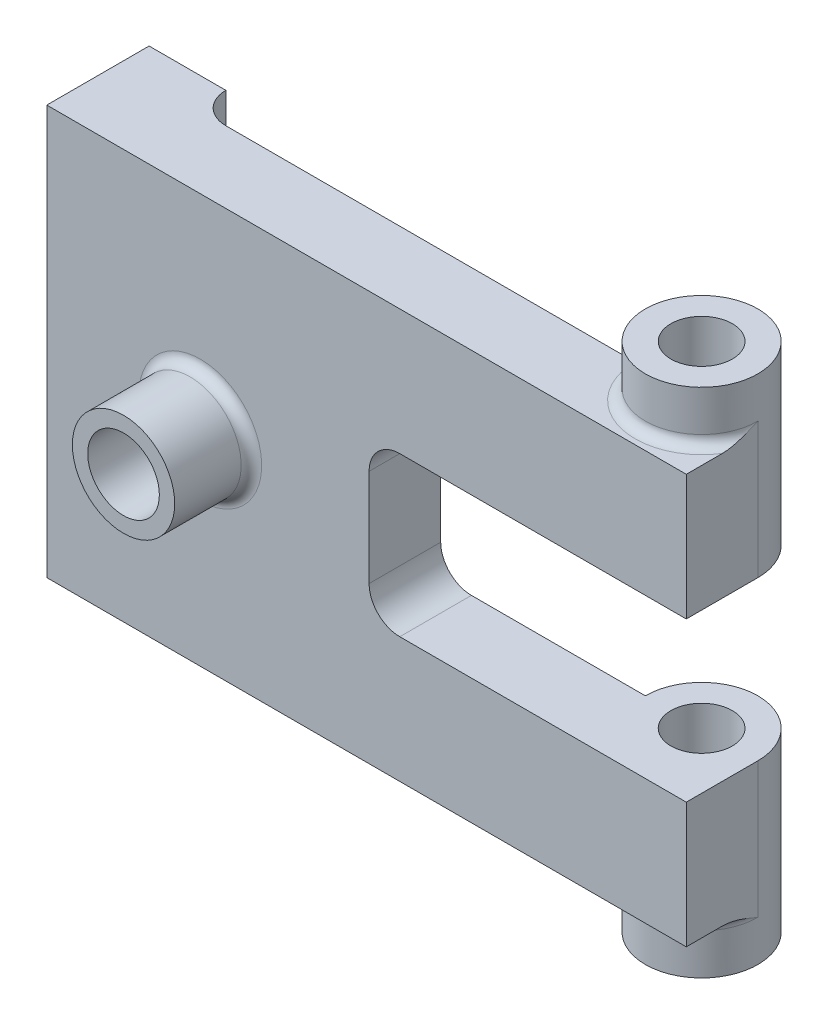
ISO-10303-21;
HEADER;
FILE_DESCRIPTION(('STEP AP214'),'2;1');
FILE_NAME('part.step','',(''),(''),'','','');
FILE_SCHEMA(('AUTOMOTIVE_DESIGN { 1 0 10303 214 1 1 1 1 }'));
ENDSEC;
DATA;
#1=APPLICATION_CONTEXT('core data for automotive mechanical design processes');
#2=APPLICATION_PROTOCOL_DEFINITION('international standard','automotive_design',2000,#1);
#3=PRODUCT_CONTEXT('',#1,'mechanical');
#4=PRODUCT('Part','Part','',(#3));
#5=PRODUCT_RELATED_PRODUCT_CATEGORY('part','',(#4));
#6=PRODUCT_DEFINITION_FORMATION('','',#4);
#7=PRODUCT_DEFINITION_CONTEXT('part definition',#1,'design');
#8=PRODUCT_DEFINITION('design','',#6,#7);
#9=PRODUCT_DEFINITION_SHAPE('','',#8);
#10=(LENGTH_UNIT() NAMED_UNIT(*) SI_UNIT(.MILLI.,.METRE.));
#11=(NAMED_UNIT(*) PLANE_ANGLE_UNIT() SI_UNIT($,.RADIAN.));
#12=(NAMED_UNIT(*) SI_UNIT($,.STERADIAN.) SOLID_ANGLE_UNIT());
#13=UNCERTAINTY_MEASURE_WITH_UNIT(LENGTH_MEASURE(1.E-05),#10,'distance_accuracy_value','');
#14=(GEOMETRIC_REPRESENTATION_CONTEXT(3) GLOBAL_UNCERTAINTY_ASSIGNED_CONTEXT((#13)) GLOBAL_UNIT_ASSIGNED_CONTEXT((#10,
#11,#12)) REPRESENTATION_CONTEXT('',''));
#15=CARTESIAN_POINT('',(0.,0.,0.));
#16=DIRECTION('',(0.,0.,1.));
#17=DIRECTION('',(1.,0.,0.));
#18=AXIS2_PLACEMENT_3D('',#15,#16,#17);
#19=CARTESIAN_POINT('',(0.,40.,-14.));
#20=DIRECTION('',(-1.,0.,0.));
#21=DIRECTION('',(0.,0.,1.));
#22=AXIS2_PLACEMENT_3D('',#19,#20,#21);
#23=PLANE('',#22);
#24=DIRECTION('',(0.,0.,1.));
#25=VECTOR('',#24,1.);
#26=CARTESIAN_POINT('',(0.,15.5,-25.));
#27=LINE('',#26,#25);
#28=CARTESIAN_POINT('',(0.,15.5,-14.));
#29=VERTEX_POINT('',#28);
#30=CARTESIAN_POINT('',(0.,15.5,0.));
#31=VERTEX_POINT('',#30);
#32=EDGE_CURVE('E390',#29,#31,#27,.T.);
#33=ORIENTED_EDGE('',*,*,#32,.F.);
#34=DIRECTION('',(0.,-1.,0.));
#35=VECTOR('',#34,1.);
#36=CARTESIAN_POINT('',(0.,40.,-14.));
#37=LINE('',#36,#35);
#38=CARTESIAN_POINT('',(0.,42.,-14.));
#39=VERTEX_POINT('',#38);
#40=EDGE_CURVE('E77',#39,#29,#37,.T.);
#41=ORIENTED_EDGE('',*,*,#40,.F.);
#42=CARTESIAN_POINT('',(0.,40.,-7.07179676972451));
#43=CARTESIAN_POINT('',(0.,40.0000195877206,-7.20368121661464));
#44=CARTESIAN_POINT('',(0.,40.0037039568171,-7.33552268574552));
#45=CARTESIAN_POINT('',(0.,40.0176384033789,-7.59878664015477));
#46=CARTESIAN_POINT('',(0.,40.0278846179913,-7.73020932625011));
#47=CARTESIAN_POINT('',(0.,40.0541440086299,-7.9920923699483));
#48=CARTESIAN_POINT('',(0.,40.0701410055856,-8.12255438981311));
#49=CARTESIAN_POINT('',(0.,40.1072767015453,-8.38275647343382));
#50=CARTESIAN_POINT('',(0.,40.1284162368858,-8.51249641624345));
#51=CARTESIAN_POINT('',(0.,40.1981930126899,-8.89777630167075));
#52=CARTESIAN_POINT('',(0.,40.2534888297203,-9.15212009356731));
#53=CARTESIAN_POINT('',(0.,40.3782545428354,-9.65743090771379));
#54=CARTESIAN_POINT('',(0.,40.4477360266855,-9.90839498939874));
#55=CARTESIAN_POINT('',(0.,40.6210301613932,-10.4842077938747));
#56=CARTESIAN_POINT('',(0.,40.7288093836496,-10.8078532041226));
#57=CARTESIAN_POINT('',(0.,40.9576910405927,-11.4504282660184));
#58=CARTESIAN_POINT('',(0.,41.0787980818546,-11.7693562436713));
#59=CARTESIAN_POINT('',(0.,41.455368919855,-12.7225560987504));
#60=CARTESIAN_POINT('',(0.,41.7235697880645,-13.351711973569));
#61=CARTESIAN_POINT('',(0.,41.9945149951131,-13.9871364921241));
#62=CARTESIAN_POINT('',(0.,41.9972575065247,-13.993568251037));
#63=CARTESIAN_POINT('',(0.,42.,-14.));
#64=B_SPLINE_CURVE_WITH_KNOTS('',3,(#42,#43,#44,#45,#46,#47,#48,#49,#50,#51,#52,#53,#54,#55,#56,
#57,#58,#59,#60,#61,#62,#63),.UNSPECIFIED.,.F.,.F.,(4,2,2,2,2,2,2,2,2,2,4),(0.,
0.395540642762622,0.790848650888229,1.18505310551169,1.57932171293576,2.35959856433425,
3.14051536472973,4.16341984179192,5.1866789886057,7.23803512077282,7.25901129773622),.UNSPECIFIED.);
#65=CARTESIAN_POINT('',(0.,40.,-7.07179676972451));
#66=VERTEX_POINT('',#65);
#67=EDGE_CURVE('E12',#39,#66,#64,.F.);
#68=ORIENTED_EDGE('',*,*,#67,.T.);
#69=DIRECTION('',(0.,0.,-1.));
#70=VECTOR('',#69,1.);
#71=CARTESIAN_POINT('',(0.,40.,-14.));
#72=LINE('',#71,#70);
#73=CARTESIAN_POINT('',(0.,40.,0.));
#74=VERTEX_POINT('',#73);
#75=EDGE_CURVE('E311',#74,#66,#72,.T.);
#76=ORIENTED_EDGE('',*,*,#75,.F.);
#77=DIRECTION('',(0.,1.,0.));
#78=VECTOR('',#77,1.);
#79=CARTESIAN_POINT('',(0.,40.,0.));
#80=LINE('',#79,#78);
#81=EDGE_CURVE('E218',#74,#31,#80,.F.);
#82=ORIENTED_EDGE('',*,*,#81,.T.);
#83=EDGE_LOOP('',(#33,#41,#68,#76,#82));
#84=FACE_BOUND('',#83,.T.);
#85=ADVANCED_FACE('F51',(#84),#23,.F.);
#86=CARTESIAN_POINT('',(-11.,40.,-14.));
#87=DIRECTION('',(0.,-1.,0.));
#88=DIRECTION('',(0.,0.,-1.));
#89=AXIS2_PLACEMENT_3D('',#86,#87,#88);
#90=CYLINDRICAL_SURFACE('',#89,11.);
#91=CARTESIAN_POINT('',(-11.,-50.,-14.));
#92=DIRECTION('',(0.,1.,0.));
#93=DIRECTION('',(0.,0.,1.));
#94=AXIS2_PLACEMENT_3D('',#91,#92,#93);
#95=CIRCLE('',#94,11.);
#96=CARTESIAN_POINT('',(-11.,-50.,-3.00000000000002));
#97=VERTEX_POINT('',#96);
#98=EDGE_CURVE('E451',#97,#97,#95,.T.);
#99=ORIENTED_EDGE('',*,*,#98,.T.);
#100=EDGE_LOOP('',(#99));
#101=FACE_BOUND('',#100,.T.);
#102=CARTESIAN_POINT('',(-11.,-42.,-14.));
#103=DIRECTION('',(0.,1.,0.));
#104=DIRECTION('',(0.,0.,1.));
#105=AXIS2_PLACEMENT_3D('',#102,#103,#104);
#106=CIRCLE('',#105,11.);
#107=CARTESIAN_POINT('',(0.,-42.,-14.));
#108=VERTEX_POINT('',#107);
#109=CARTESIAN_POINT('',(-22.,-42.,-14.));
#110=VERTEX_POINT('',#109);
#111=EDGE_CURVE('E230',#108,#110,#106,.F.);
#112=ORIENTED_EDGE('',*,*,#111,.T.);
#113=DIRECTION('',(0.,-1.,0.));
#114=VECTOR('',#113,1.);
#115=CARTESIAN_POINT('',(-22.,40.,-14.));
#116=LINE('',#115,#114);
#117=CARTESIAN_POINT('',(-22.,-15.5,-14.));
#118=VERTEX_POINT('',#117);
#119=EDGE_CURVE('E308',#118,#110,#116,.T.);
#120=ORIENTED_EDGE('',*,*,#119,.F.);
#121=CARTESIAN_POINT('',(-11.,-15.5,-14.));
#122=DIRECTION('',(0.,-1.,0.));
#123=DIRECTION('',(0.,0.,-1.));
#124=AXIS2_PLACEMENT_3D('',#121,#122,#123);
#125=CIRCLE('',#124,11.);
#126=CARTESIAN_POINT('',(0.,-15.5,-14.));
#127=VERTEX_POINT('',#126);
#128=EDGE_CURVE('E530',#118,#127,#125,.T.);
#129=ORIENTED_EDGE('',*,*,#128,.T.);
#130=EDGE_CURVE('E300',#127,#108,#37,.T.);
#131=ORIENTED_EDGE('',*,*,#130,.T.);
#132=EDGE_LOOP('',(#112,#120,#129,#131));
#133=FACE_BOUND('',#132,.T.);
#134=ADVANCED_FACE('F279',(#101,#133),#90,.T.);
#135=CARTESIAN_POINT('',(0.,40.,0.));
#136=DIRECTION('',(0.,0.,-1.));
#137=DIRECTION('',(-1.,0.,0.));
#138=AXIS2_PLACEMENT_3D('',#135,#136,#137);
#139=PLANE('',#138);
#140=CARTESIAN_POINT('',(-95.,0.,0.));
#141=DIRECTION('',(0.,0.,-1.));
#142=DIRECTION('',(-1.,0.,0.));
#143=AXIS2_PLACEMENT_3D('',#140,#141,#142);
#144=CIRCLE('',#143,12.);
#145=CARTESIAN_POINT('',(-107.,0.,0.));
#146=VERTEX_POINT('',#145);
#147=EDGE_CURVE('E244',#146,#146,#144,.T.);
#148=ORIENTED_EDGE('',*,*,#147,.T.);
#149=EDGE_LOOP('',(#148));
#150=FACE_BOUND('',#149,.T.);
#151=DIRECTION('',(1.,0.,0.));
#152=VECTOR('',#151,1.);
#153=CARTESIAN_POINT('',(0.,-15.5,0.));
#154=LINE('',#153,#152);
#155=CARTESIAN_POINT('',(-56.,-15.5,6.E-06));
#156=VERTEX_POINT('',#155);
#157=CARTESIAN_POINT('',(0.,-15.5,0.));
#158=VERTEX_POINT('',#157);
#159=EDGE_CURVE('E172',#156,#158,#154,.T.);
#160=ORIENTED_EDGE('',*,*,#159,.F.);
#161=CARTESIAN_POINT('',(-56.,-9.5,1.20000000006226E-05));
#162=DIRECTION('',(0.,0.,1.));
#163=DIRECTION('',(-1.,0.,0.));
#164=AXIS2_PLACEMENT_3D('',#161,#162,#163);
#165=CIRCLE('',#164,6.);
#166=CARTESIAN_POINT('',(-62.,-9.5,6.00000000015546E-06));
#167=VERTEX_POINT('',#166);
#168=EDGE_CURVE('E183',#167,#156,#165,.T.);
#169=ORIENTED_EDGE('',*,*,#168,.F.);
#170=DIRECTION('',(0.,-1.,0.));
#171=VECTOR('',#170,1.);
#172=CARTESIAN_POINT('',(-62.,-9.49999999999996,0.));
#173=LINE('',#172,#171);
#174=CARTESIAN_POINT('',(-62.,9.5,6.00000000015546E-06));
#175=VERTEX_POINT('',#174);
#176=EDGE_CURVE('E193',#175,#167,#173,.T.);
#177=ORIENTED_EDGE('',*,*,#176,.F.);
#178=CARTESIAN_POINT('',(-56.,9.5,1.20000000006226E-05));
#179=DIRECTION('',(0.,0.,1.));
#180=DIRECTION('',(0.,1.,0.));
#181=AXIS2_PLACEMENT_3D('',#178,#179,#180);
#182=CIRCLE('',#181,6.);
#183=CARTESIAN_POINT('',(-56.,15.5,0.));
#184=VERTEX_POINT('',#183);
#185=EDGE_CURVE('E207',#184,#175,#182,.T.);
#186=ORIENTED_EDGE('',*,*,#185,.F.);
#187=DIRECTION('',(-1.,0.,0.));
#188=VECTOR('',#187,1.);
#189=CARTESIAN_POINT('',(0.,15.5,0.));
#190=LINE('',#189,#188);
#191=EDGE_CURVE('E201',#31,#184,#190,.T.);
#192=ORIENTED_EDGE('',*,*,#191,.F.);
#193=ORIENTED_EDGE('',*,*,#81,.F.);
#194=DIRECTION('',(1.,0.,0.));
#195=VECTOR('',#194,1.);
#196=CARTESIAN_POINT('',(0.,40.,0.));
#197=LINE('',#196,#195);
#198=CARTESIAN_POINT('',(-125.,40.,0.));
#199=VERTEX_POINT('',#198);
#200=EDGE_CURVE('E228',#199,#74,#197,.T.);
#201=ORIENTED_EDGE('',*,*,#200,.F.);
#202=DIRECTION('',(0.,-1.,0.));
#203=VECTOR('',#202,1.);
#204=CARTESIAN_POINT('',(-125.,40.,0.));
#205=LINE('',#204,#203);
#206=CARTESIAN_POINT('',(-125.,-40.,0.));
#207=VERTEX_POINT('',#206);
#208=EDGE_CURVE('E224',#199,#207,#205,.T.);
#209=ORIENTED_EDGE('',*,*,#208,.T.);
#210=DIRECTION('',(1.,0.,0.));
#211=VECTOR('',#210,1.);
#212=CARTESIAN_POINT('',(0.,-40.,0.));
#213=LINE('',#212,#211);
#214=CARTESIAN_POINT('',(0.,-40.,0.));
#215=VERTEX_POINT('',#214);
#216=EDGE_CURVE('E318',#207,#215,#213,.T.);
#217=ORIENTED_EDGE('',*,*,#216,.T.);
#218=DIRECTION('',(0.,1.,0.));
#219=VECTOR('',#218,1.);
#220=CARTESIAN_POINT('',(0.,40.,0.));
#221=LINE('',#220,#219);
#222=EDGE_CURVE('E203',#158,#215,#221,.F.);
#223=ORIENTED_EDGE('',*,*,#222,.F.);
#224=EDGE_LOOP('',(#160,#169,#177,#186,#192,#193,#201,#209,#217,#223));
#225=FACE_BOUND('',#224,.T.);
#226=ADVANCED_FACE('F200',(#150,#225),#139,.F.);
#227=CARTESIAN_POINT('',(-11.,40.,-14.));
#228=DIRECTION('',(0.,-1.,0.));
#229=DIRECTION('',(0.,0.,-1.));
#230=AXIS2_PLACEMENT_3D('',#227,#228,#229);
#231=CYLINDRICAL_SURFACE('',#230,6.);
#232=CARTESIAN_POINT('',(-11.,-15.5,-14.));
#233=DIRECTION('',(0.,-1.,0.));
#234=DIRECTION('',(0.,0.,-1.));
#235=AXIS2_PLACEMENT_3D('',#232,#233,#234);
#236=CIRCLE('',#235,6.);
#237=CARTESIAN_POINT('',(-11.,-15.5,-20.));
#238=VERTEX_POINT('',#237);
#239=EDGE_CURVE('E332',#238,#238,#236,.T.);
#240=ORIENTED_EDGE('',*,*,#239,.F.);
#241=EDGE_LOOP('',(#240));
#242=FACE_BOUND('',#241,.T.);
#243=CARTESIAN_POINT('',(-11.,-50.,-14.));
#244=DIRECTION('',(0.,1.,0.));
#245=DIRECTION('',(0.,0.,1.));
#246=AXIS2_PLACEMENT_3D('',#243,#244,#245);
#247=CIRCLE('',#246,6.);
#248=CARTESIAN_POINT('',(-11.,-50.,-8.00000000000002));
#249=VERTEX_POINT('',#248);
#250=EDGE_CURVE('E366',#249,#249,#247,.T.);
#251=ORIENTED_EDGE('',*,*,#250,.F.);
#252=EDGE_LOOP('',(#251));
#253=FACE_BOUND('',#252,.T.);
#254=ADVANCED_FACE('F348',(#242,#253),#231,.F.);
#255=CARTESIAN_POINT('',(-104.,40.,-20.));
#256=DIRECTION('',(0.,1.,0.));
#257=DIRECTION('',(0.,0.,1.));
#258=AXIS2_PLACEMENT_3D('',#255,#256,#257);
#259=PLANE('',#258);
#260=ORIENTED_EDGE('',*,*,#75,.T.);
#261=CARTESIAN_POINT('',(-11.,40.,-14.));
#262=DIRECTION('',(0.,1.,0.));
#263=DIRECTION('',(0.,0.,1.));
#264=AXIS2_PLACEMENT_3D('',#261,#262,#263);
#265=CIRCLE('',#264,13.);
#266=CARTESIAN_POINT('',(-24.,40.,-14.));
#267=VERTEX_POINT('',#266);
#268=EDGE_CURVE('E231',#66,#267,#265,.F.);
#269=ORIENTED_EDGE('',*,*,#268,.T.);
#270=DIRECTION('',(-1.,0.,0.));
#271=VECTOR('',#270,1.);
#272=CARTESIAN_POINT('',(-104.,40.,-14.));
#273=LINE('',#272,#271);
#274=CARTESIAN_POINT('',(-104.,40.,-14.));
#275=VERTEX_POINT('',#274);
#276=EDGE_CURVE('E320',#267,#275,#273,.T.);
#277=ORIENTED_EDGE('',*,*,#276,.T.);
#278=CARTESIAN_POINT('',(-104.,40.,-20.));
#279=DIRECTION('',(0.,-1.,0.));
#280=DIRECTION('',(0.,0.,1.));
#281=AXIS2_PLACEMENT_3D('',#278,#279,#280);
#282=CIRCLE('',#281,5.99999999999998);
#283=CARTESIAN_POINT('',(-110.,40.,-20.));
#284=VERTEX_POINT('',#283);
#285=EDGE_CURVE('E446',#275,#284,#282,.T.);
#286=ORIENTED_EDGE('',*,*,#285,.T.);
#287=DIRECTION('',(-1.,0.,0.));
#288=VECTOR('',#287,1.);
#289=CARTESIAN_POINT('',(-125.,40.,-20.));
#290=LINE('',#289,#288);
#291=CARTESIAN_POINT('',(-125.,40.,-20.));
#292=VERTEX_POINT('',#291);
#293=EDGE_CURVE('E452',#284,#292,#290,.T.);
#294=ORIENTED_EDGE('',*,*,#293,.T.);
#295=DIRECTION('',(0.,0.,1.));
#296=VECTOR('',#295,1.);
#297=CARTESIAN_POINT('',(-125.,40.,0.));
#298=LINE('',#297,#296);
#299=EDGE_CURVE('E315',#292,#199,#298,.T.);
#300=ORIENTED_EDGE('',*,*,#299,.T.);
#301=ORIENTED_EDGE('',*,*,#200,.T.);
#302=EDGE_LOOP('',(#260,#269,#277,#286,#294,#300,#301));
#303=FACE_BOUND('',#302,.T.);
#304=ADVANCED_FACE('F291',(#303),#259,.T.);
#305=CARTESIAN_POINT('',(-104.,-40.,-20.));
#306=DIRECTION('',(0.,1.,0.));
#307=DIRECTION('',(0.,0.,1.));
#308=AXIS2_PLACEMENT_3D('',#305,#306,#307);
#309=PLANE('',#308);
#310=DIRECTION('',(-1.,0.,0.));
#311=VECTOR('',#310,1.);
#312=CARTESIAN_POINT('',(-104.,-40.,-14.));
#313=LINE('',#312,#311);
#314=CARTESIAN_POINT('',(-24.,-40.,-14.));
#315=VERTEX_POINT('',#314);
#316=CARTESIAN_POINT('',(-104.,-40.,-14.));
#317=VERTEX_POINT('',#316);
#318=EDGE_CURVE('E324',#315,#317,#313,.T.);
#319=ORIENTED_EDGE('',*,*,#318,.F.);
#320=CARTESIAN_POINT('',(-11.,-40.,-14.));
#321=DIRECTION('',(0.,1.,0.));
#322=DIRECTION('',(0.,0.,1.));
#323=AXIS2_PLACEMENT_3D('',#320,#321,#322);
#324=CIRCLE('',#323,13.);
#325=CARTESIAN_POINT('',(0.,-40.,-7.07179676972451));
#326=VERTEX_POINT('',#325);
#327=EDGE_CURVE('E232',#315,#326,#324,.T.);
#328=ORIENTED_EDGE('',*,*,#327,.T.);
#329=DIRECTION('',(0.,0.,-1.));
#330=VECTOR('',#329,1.);
#331=CARTESIAN_POINT('',(0.,-40.,-14.));
#332=LINE('',#331,#330);
#333=EDGE_CURVE('E325',#215,#326,#332,.T.);
#334=ORIENTED_EDGE('',*,*,#333,.F.);
#335=ORIENTED_EDGE('',*,*,#216,.F.);
#336=DIRECTION('',(0.,0.,1.));
#337=VECTOR('',#336,1.);
#338=CARTESIAN_POINT('',(-125.,-40.,0.));
#339=LINE('',#338,#337);
#340=CARTESIAN_POINT('',(-125.,-40.,-20.));
#341=VERTEX_POINT('',#340);
#342=EDGE_CURVE('E321',#341,#207,#339,.T.);
#343=ORIENTED_EDGE('',*,*,#342,.F.);
#344=DIRECTION('',(-1.,0.,0.));
#345=VECTOR('',#344,1.);
#346=CARTESIAN_POINT('',(-125.,-40.,-20.));
#347=LINE('',#346,#345);
#348=CARTESIAN_POINT('',(-110.,-40.,-20.));
#349=VERTEX_POINT('',#348);
#350=EDGE_CURVE('E467',#349,#341,#347,.T.);
#351=ORIENTED_EDGE('',*,*,#350,.F.);
#352=CARTESIAN_POINT('',(-104.,-40.,-20.));
#353=DIRECTION('',(0.,-1.,0.));
#354=DIRECTION('',(0.,0.,1.));
#355=AXIS2_PLACEMENT_3D('',#352,#353,#354);
#356=CIRCLE('',#355,5.99999999999998);
#357=EDGE_CURVE('E461',#317,#349,#356,.T.);
#358=ORIENTED_EDGE('',*,*,#357,.F.);
#359=EDGE_LOOP('',(#319,#328,#334,#335,#343,#351,#358));
#360=FACE_BOUND('',#359,.T.);
#361=ADVANCED_FACE('F287',(#360),#309,.F.);
#362=ORIENTED_EDGE('',*,*,#130,.F.);
#363=DIRECTION('',(0.,0.,1.));
#364=VECTOR('',#363,1.);
#365=CARTESIAN_POINT('',(0.,-15.5,-25.));
#366=LINE('',#365,#364);
#367=EDGE_CURVE('E191',#127,#158,#366,.T.);
#368=ORIENTED_EDGE('',*,*,#367,.T.);
#369=ORIENTED_EDGE('',*,*,#222,.T.);
#370=ORIENTED_EDGE('',*,*,#333,.T.);
#371=CARTESIAN_POINT('',(0.,-40.,-7.07179676972451));
#372=CARTESIAN_POINT('',(0.,-40.0000195877206,-7.20368121661464));
#373=CARTESIAN_POINT('',(0.,-40.0037039568171,-7.33552268574552));
#374=CARTESIAN_POINT('',(0.,-40.0176384033789,-7.59878664015477));
#375=CARTESIAN_POINT('',(0.,-40.0278846179913,-7.73020932625011));
#376=CARTESIAN_POINT('',(0.,-40.0541440086299,-7.9920923699483));
#377=CARTESIAN_POINT('',(0.,-40.0701410055856,-8.12255438981311));
#378=CARTESIAN_POINT('',(0.,-40.1072767015453,-8.38275647343382));
#379=CARTESIAN_POINT('',(0.,-40.1284162368858,-8.51249641624345));
#380=CARTESIAN_POINT('',(0.,-40.1981930126899,-8.89777630167075));
#381=CARTESIAN_POINT('',(0.,-40.2534888297203,-9.15212009356731));
#382=CARTESIAN_POINT('',(0.,-40.3782545428354,-9.65743090771379));
#383=CARTESIAN_POINT('',(0.,-40.4477360266855,-9.90839498939874));
#384=CARTESIAN_POINT('',(0.,-40.6210301613932,-10.4842077938747));
#385=CARTESIAN_POINT('',(0.,-40.7288093836496,-10.8078532041226));
#386=CARTESIAN_POINT('',(0.,-40.9576910405927,-11.4504282660184));
#387=CARTESIAN_POINT('',(0.,-41.0787980818546,-11.7693562436713));
#388=CARTESIAN_POINT('',(0.,-41.455368919855,-12.7225560987504));
#389=CARTESIAN_POINT('',(0.,-41.7235697880645,-13.351711973569));
#390=CARTESIAN_POINT('',(0.,-41.9945149951131,-13.9871364921241));
#391=CARTESIAN_POINT('',(0.,-41.9972575065247,-13.993568251037));
#392=CARTESIAN_POINT('',(0.,-42.,-14.));
#393=B_SPLINE_CURVE_WITH_KNOTS('',3,(#371,#372,#373,#374,#375,#376,#377,#378,#379,#380,#381,
#382,#383,#384,#385,#386,#387,#388,#389,#390,#391,#392),.UNSPECIFIED.,.F.,.F.,(4,2,2,2,2,2,2,2,
2,2,4),(0.,0.395540642762622,0.790848650888229,1.18505310551169,1.57932171293576,
2.35959856433425,3.14051536472973,4.16341984179192,5.1866789886057,7.23803512077282,
7.25901129773622),.UNSPECIFIED.);
#394=EDGE_CURVE('E252',#326,#108,#393,.T.);
#395=ORIENTED_EDGE('',*,*,#394,.T.);
#396=EDGE_LOOP('',(#362,#368,#369,#370,#395));
#397=FACE_BOUND('',#396,.T.);
#398=ADVANCED_FACE('F257',(#397),#23,.F.);
#399=CARTESIAN_POINT('',(-22.,42.,-14.));
#400=VERTEX_POINT('',#399);
#401=CARTESIAN_POINT('',(-22.,15.5,-14.));
#402=VERTEX_POINT('',#401);
#403=EDGE_CURVE('E75',#400,#402,#116,.T.);
#404=ORIENTED_EDGE('',*,*,#403,.F.);
#405=CARTESIAN_POINT('',(-11.,42.,-14.));
#406=DIRECTION('',(0.,1.,0.));
#407=DIRECTION('',(0.,0.,1.));
#408=AXIS2_PLACEMENT_3D('',#405,#406,#407);
#409=CIRCLE('',#408,11.);
#410=EDGE_CURVE('E236',#400,#39,#409,.T.);
#411=ORIENTED_EDGE('',*,*,#410,.T.);
#412=ORIENTED_EDGE('',*,*,#40,.T.);
#413=CARTESIAN_POINT('',(-11.,15.5,-14.));
#414=DIRECTION('',(0.,1.,0.));
#415=DIRECTION('',(0.,0.,1.));
#416=AXIS2_PLACEMENT_3D('',#413,#414,#415);
#417=CIRCLE('',#416,11.);
#418=EDGE_CURVE('E331',#29,#402,#417,.T.);
#419=ORIENTED_EDGE('',*,*,#418,.T.);
#420=EDGE_LOOP('',(#404,#411,#412,#419));
#421=FACE_BOUND('',#420,.T.);
#422=CARTESIAN_POINT('',(-11.,50.,-14.));
#423=DIRECTION('',(0.,1.,0.));
#424=DIRECTION('',(0.,0.,1.));
#425=AXIS2_PLACEMENT_3D('',#422,#423,#424);
#426=CIRCLE('',#425,11.);
#427=CARTESIAN_POINT('',(-11.,50.,-3.00000000000002));
#428=VERTEX_POINT('',#427);
#429=EDGE_CURVE('E326',#428,#428,#426,.T.);
#430=ORIENTED_EDGE('',*,*,#429,.F.);
#431=EDGE_LOOP('',(#430));
#432=FACE_BOUND('',#431,.T.);
#433=ADVANCED_FACE('F282',(#421,#432),#90,.T.);
#434=CARTESIAN_POINT('',(-104.,40.,-14.));
#435=DIRECTION('',(0.,0.,1.));
#436=DIRECTION('',(1.,0.,0.));
#437=AXIS2_PLACEMENT_3D('',#434,#435,#436);
#438=PLANE('',#437);
#439=CARTESIAN_POINT('',(-95.,0.,-14.));
#440=DIRECTION('',(0.,0.,1.));
#441=DIRECTION('',(1.,0.,0.));
#442=AXIS2_PLACEMENT_3D('',#439,#440,#441);
#443=CIRCLE('',#442,7.);
#444=CARTESIAN_POINT('',(-88.,0.,-14.));
#445=VERTEX_POINT('',#444);
#446=EDGE_CURVE('E356',#445,#445,#443,.T.);
#447=ORIENTED_EDGE('',*,*,#446,.T.);
#448=EDGE_LOOP('',(#447));
#449=FACE_BOUND('',#448,.T.);
#450=CARTESIAN_POINT('',(-56.,-9.5,-14.));
#451=DIRECTION('',(0.,0.,1.));
#452=DIRECTION('',(1.,0.,0.));
#453=AXIS2_PLACEMENT_3D('',#450,#451,#452);
#454=CIRCLE('',#453,6.);
#455=CARTESIAN_POINT('',(-62.,-9.49999999999996,-14.));
#456=VERTEX_POINT('',#455);
#457=CARTESIAN_POINT('',(-56.,-15.5,-14.));
#458=VERTEX_POINT('',#457);
#459=EDGE_CURVE('E369',#456,#458,#454,.T.);
#460=ORIENTED_EDGE('',*,*,#459,.T.);
#461=DIRECTION('',(1.,0.,0.));
#462=VECTOR('',#461,1.);
#463=CARTESIAN_POINT('',(-104.,-15.5,-14.));
#464=LINE('',#463,#462);
#465=EDGE_CURVE('E180',#458,#118,#464,.T.);
#466=ORIENTED_EDGE('',*,*,#465,.T.);
#467=ORIENTED_EDGE('',*,*,#119,.T.);
#468=CARTESIAN_POINT('',(-24.,-42.,-14.));
#469=DIRECTION('',(0.,0.,1.));
#470=DIRECTION('',(1.,0.,0.));
#471=AXIS2_PLACEMENT_3D('',#468,#469,#470);
#472=CIRCLE('',#471,2.);
#473=EDGE_CURVE('E246',#110,#315,#472,.T.);
#474=ORIENTED_EDGE('',*,*,#473,.T.);
#475=ORIENTED_EDGE('',*,*,#318,.T.);
#476=DIRECTION('',(0.,-1.,0.));
#477=VECTOR('',#476,1.);
#478=CARTESIAN_POINT('',(-104.,40.,-14.));
#479=LINE('',#478,#477);
#480=EDGE_CURVE('E443',#275,#317,#479,.T.);
#481=ORIENTED_EDGE('',*,*,#480,.F.);
#482=ORIENTED_EDGE('',*,*,#276,.F.);
#483=CARTESIAN_POINT('',(-24.,42.,-14.));
#484=DIRECTION('',(0.,0.,1.));
#485=DIRECTION('',(1.,0.,0.));
#486=AXIS2_PLACEMENT_3D('',#483,#484,#485);
#487=CIRCLE('',#486,2.);
#488=EDGE_CURVE('E64',#267,#400,#487,.T.);
#489=ORIENTED_EDGE('',*,*,#488,.T.);
#490=ORIENTED_EDGE('',*,*,#403,.T.);
#491=DIRECTION('',(-1.,0.,0.));
#492=VECTOR('',#491,1.);
#493=CARTESIAN_POINT('',(-104.,15.5,-14.));
#494=LINE('',#493,#492);
#495=CARTESIAN_POINT('',(-56.,15.5,-14.));
#496=VERTEX_POINT('',#495);
#497=EDGE_CURVE('E329',#402,#496,#494,.T.);
#498=ORIENTED_EDGE('',*,*,#497,.T.);
#499=CARTESIAN_POINT('',(-56.,9.5,-14.));
#500=DIRECTION('',(0.,0.,1.));
#501=DIRECTION('',(1.,0.,0.));
#502=AXIS2_PLACEMENT_3D('',#499,#500,#501);
#503=CIRCLE('',#502,6.);
#504=CARTESIAN_POINT('',(-62.,9.49999999999996,-14.));
#505=VERTEX_POINT('',#504);
#506=EDGE_CURVE('E535',#496,#505,#503,.T.);
#507=ORIENTED_EDGE('',*,*,#506,.T.);
#508=DIRECTION('',(0.,-1.,0.));
#509=VECTOR('',#508,1.);
#510=CARTESIAN_POINT('',(-62.,40.,-14.));
#511=LINE('',#510,#509);
#512=EDGE_CURVE('E540',#505,#456,#511,.T.);
#513=ORIENTED_EDGE('',*,*,#512,.T.);
#514=EDGE_LOOP('',(#460,#466,#467,#474,#475,#481,#482,#489,#490,#498,#507,#513));
#515=FACE_BOUND('',#514,.T.);
#516=ADVANCED_FACE('F295',(#449,#515),#438,.F.);
#517=CARTESIAN_POINT('',(-104.,40.,-20.));
#518=DIRECTION('',(0.,-1.,0.));
#519=DIRECTION('',(0.,0.,-1.));
#520=AXIS2_PLACEMENT_3D('',#517,#518,#519);
#521=CYLINDRICAL_SURFACE('',#520,5.99999999999998);
#522=ORIENTED_EDGE('',*,*,#357,.T.);
#523=DIRECTION('',(0.,-1.,0.));
#524=VECTOR('',#523,1.);
#525=CARTESIAN_POINT('',(-110.,40.,-20.));
#526=LINE('',#525,#524);
#527=EDGE_CURVE('E476',#284,#349,#526,.T.);
#528=ORIENTED_EDGE('',*,*,#527,.F.);
#529=ORIENTED_EDGE('',*,*,#285,.F.);
#530=ORIENTED_EDGE('',*,*,#480,.T.);
#531=EDGE_LOOP('',(#522,#528,#529,#530));
#532=FACE_BOUND('',#531,.T.);
#533=ADVANCED_FACE('F503',(#532),#521,.F.);
#534=CARTESIAN_POINT('',(-125.,40.,-20.));
#535=DIRECTION('',(0.,0.,1.));
#536=DIRECTION('',(1.,0.,0.));
#537=AXIS2_PLACEMENT_3D('',#534,#535,#536);
#538=PLANE('',#537);
#539=ORIENTED_EDGE('',*,*,#350,.T.);
#540=DIRECTION('',(0.,-1.,0.));
#541=VECTOR('',#540,1.);
#542=CARTESIAN_POINT('',(-125.,40.,-20.));
#543=LINE('',#542,#541);
#544=EDGE_CURVE('E475',#292,#341,#543,.T.);
#545=ORIENTED_EDGE('',*,*,#544,.F.);
#546=ORIENTED_EDGE('',*,*,#293,.F.);
#547=ORIENTED_EDGE('',*,*,#527,.T.);
#548=EDGE_LOOP('',(#539,#545,#546,#547));
#549=FACE_BOUND('',#548,.T.);
#550=ADVANCED_FACE('F496',(#549),#538,.F.);
#551=CARTESIAN_POINT('',(-125.,40.,0.));
#552=DIRECTION('',(1.,0.,0.));
#553=DIRECTION('',(0.,0.,-1.));
#554=AXIS2_PLACEMENT_3D('',#551,#552,#553);
#555=PLANE('',#554);
#556=ORIENTED_EDGE('',*,*,#342,.T.);
#557=ORIENTED_EDGE('',*,*,#208,.F.);
#558=ORIENTED_EDGE('',*,*,#299,.F.);
#559=ORIENTED_EDGE('',*,*,#544,.T.);
#560=EDGE_LOOP('',(#556,#557,#558,#559));
#561=FACE_BOUND('',#560,.T.);
#562=ADVANCED_FACE('F351',(#561),#555,.F.);
#563=CARTESIAN_POINT('',(-11.,-50.,-14.));
#564=DIRECTION('',(0.,1.,0.));
#565=DIRECTION('',(0.,0.,1.));
#566=AXIS2_PLACEMENT_3D('',#563,#564,#565);
#567=PLANE('',#566);
#568=ORIENTED_EDGE('',*,*,#98,.F.);
#569=EDGE_LOOP('',(#568));
#570=FACE_BOUND('',#569,.T.);
#571=ORIENTED_EDGE('',*,*,#250,.T.);
#572=EDGE_LOOP('',(#571));
#573=FACE_BOUND('',#572,.T.);
#574=ADVANCED_FACE('F425',(#570,#573),#567,.F.);
#575=CARTESIAN_POINT('',(-11.,15.5,-14.));
#576=DIRECTION('',(0.,1.,0.));
#577=DIRECTION('',(0.,0.,1.));
#578=AXIS2_PLACEMENT_3D('',#575,#576,#577);
#579=CIRCLE('',#578,6.);
#580=CARTESIAN_POINT('',(-11.,15.5,-8.00000000000002));
#581=VERTEX_POINT('',#580);
#582=EDGE_CURVE('E182',#581,#581,#579,.T.);
#583=ORIENTED_EDGE('',*,*,#582,.F.);
#584=EDGE_LOOP('',(#583));
#585=FACE_BOUND('',#584,.T.);
#586=CARTESIAN_POINT('',(-11.,50.,-14.));
#587=DIRECTION('',(0.,1.,0.));
#588=DIRECTION('',(0.,0.,1.));
#589=AXIS2_PLACEMENT_3D('',#586,#587,#588);
#590=CIRCLE('',#589,6.);
#591=CARTESIAN_POINT('',(-11.,50.,-8.00000000000002));
#592=VERTEX_POINT('',#591);
#593=EDGE_CURVE('E546',#592,#592,#590,.T.);
#594=ORIENTED_EDGE('',*,*,#593,.T.);
#595=EDGE_LOOP('',(#594));
#596=FACE_BOUND('',#595,.T.);
#597=ADVANCED_FACE('F419',(#585,#596),#231,.F.);
#598=CARTESIAN_POINT('',(-11.,50.,-14.));
#599=DIRECTION('',(0.,1.,0.));
#600=DIRECTION('',(0.,0.,1.));
#601=AXIS2_PLACEMENT_3D('',#598,#599,#600);
#602=PLANE('',#601);
#603=ORIENTED_EDGE('',*,*,#429,.T.);
#604=EDGE_LOOP('',(#603));
#605=FACE_BOUND('',#604,.T.);
#606=ORIENTED_EDGE('',*,*,#593,.F.);
#607=EDGE_LOOP('',(#606));
#608=FACE_BOUND('',#607,.T.);
#609=ADVANCED_FACE('F417',(#605,#608),#602,.T.);
#610=CARTESIAN_POINT('',(-56.,-9.5,-25.));
#611=DIRECTION('',(0.,0.,1.));
#612=DIRECTION('',(1.,0.,0.));
#613=AXIS2_PLACEMENT_3D('',#610,#611,#612);
#614=CYLINDRICAL_SURFACE('',#613,6.);
#615=DIRECTION('',(0.,0.,1.));
#616=VECTOR('',#615,1.);
#617=CARTESIAN_POINT('',(-62.,-9.49999999999996,-25.));
#618=LINE('',#617,#616);
#619=EDGE_CURVE('E185',#456,#167,#618,.T.);
#620=ORIENTED_EDGE('',*,*,#619,.T.);
#621=ORIENTED_EDGE('',*,*,#168,.T.);
#622=DIRECTION('',(0.,0.,1.));
#623=VECTOR('',#622,1.);
#624=CARTESIAN_POINT('',(-56.,-15.5,-25.));
#625=LINE('',#624,#623);
#626=EDGE_CURVE('E166',#458,#156,#625,.T.);
#627=ORIENTED_EDGE('',*,*,#626,.F.);
#628=ORIENTED_EDGE('',*,*,#459,.F.);
#629=EDGE_LOOP('',(#620,#621,#627,#628));
#630=FACE_BOUND('',#629,.T.);
#631=ADVANCED_FACE('F190',(#630),#614,.F.);
#632=CARTESIAN_POINT('',(-62.,-9.49999999999996,-25.));
#633=DIRECTION('',(-1.,0.,0.));
#634=DIRECTION('',(0.,0.,1.));
#635=AXIS2_PLACEMENT_3D('',#632,#633,#634);
#636=PLANE('',#635);
#637=DIRECTION('',(0.,0.,1.));
#638=VECTOR('',#637,1.);
#639=CARTESIAN_POINT('',(-62.,9.49999999999996,-25.));
#640=LINE('',#639,#638);
#641=EDGE_CURVE('E381',#505,#175,#640,.T.);
#642=ORIENTED_EDGE('',*,*,#641,.T.);
#643=ORIENTED_EDGE('',*,*,#176,.T.);
#644=ORIENTED_EDGE('',*,*,#619,.F.);
#645=ORIENTED_EDGE('',*,*,#512,.F.);
#646=EDGE_LOOP('',(#642,#643,#644,#645));
#647=FACE_BOUND('',#646,.T.);
#648=ADVANCED_FACE('F401',(#647),#636,.F.);
#649=CARTESIAN_POINT('',(-56.,9.5,-25.));
#650=DIRECTION('',(0.,0.,1.));
#651=DIRECTION('',(1.,0.,0.));
#652=AXIS2_PLACEMENT_3D('',#649,#650,#651);
#653=CYLINDRICAL_SURFACE('',#652,6.);
#654=DIRECTION('',(0.,0.,1.));
#655=VECTOR('',#654,1.);
#656=CARTESIAN_POINT('',(-56.,15.5,-25.));
#657=LINE('',#656,#655);
#658=EDGE_CURVE('E382',#496,#184,#657,.T.);
#659=ORIENTED_EDGE('',*,*,#658,.T.);
#660=ORIENTED_EDGE('',*,*,#185,.T.);
#661=ORIENTED_EDGE('',*,*,#641,.F.);
#662=ORIENTED_EDGE('',*,*,#506,.F.);
#663=EDGE_LOOP('',(#659,#660,#661,#662));
#664=FACE_BOUND('',#663,.T.);
#665=ADVANCED_FACE('F377',(#664),#653,.F.);
#666=CARTESIAN_POINT('',(0.,-15.5,-25.));
#667=DIRECTION('',(0.,-1.,0.));
#668=DIRECTION('',(0.,0.,-1.));
#669=AXIS2_PLACEMENT_3D('',#666,#667,#668);
#670=PLANE('',#669);
#671=ORIENTED_EDGE('',*,*,#239,.T.);
#672=EDGE_LOOP('',(#671));
#673=FACE_BOUND('',#672,.T.);
#674=ORIENTED_EDGE('',*,*,#128,.F.);
#675=ORIENTED_EDGE('',*,*,#465,.F.);
#676=ORIENTED_EDGE('',*,*,#626,.T.);
#677=ORIENTED_EDGE('',*,*,#159,.T.);
#678=ORIENTED_EDGE('',*,*,#367,.F.);
#679=EDGE_LOOP('',(#674,#675,#676,#677,#678));
#680=FACE_BOUND('',#679,.T.);
#681=ADVANCED_FACE('F173',(#673,#680),#670,.F.);
#682=CARTESIAN_POINT('',(0.,15.5,-25.));
#683=DIRECTION('',(0.,1.,0.));
#684=DIRECTION('',(0.,0.,1.));
#685=AXIS2_PLACEMENT_3D('',#682,#683,#684);
#686=PLANE('',#685);
#687=ORIENTED_EDGE('',*,*,#582,.T.);
#688=EDGE_LOOP('',(#687));
#689=FACE_BOUND('',#688,.T.);
#690=ORIENTED_EDGE('',*,*,#32,.T.);
#691=ORIENTED_EDGE('',*,*,#191,.T.);
#692=ORIENTED_EDGE('',*,*,#658,.F.);
#693=ORIENTED_EDGE('',*,*,#497,.F.);
#694=ORIENTED_EDGE('',*,*,#418,.F.);
#695=EDGE_LOOP('',(#690,#691,#692,#693,#694));
#696=FACE_BOUND('',#695,.T.);
#697=ADVANCED_FACE('F403',(#689,#696),#686,.F.);
#698=CARTESIAN_POINT('',(-95.,0.,-25.));
#699=DIRECTION('',(0.,0.,1.));
#700=DIRECTION('',(1.,0.,0.));
#701=AXIS2_PLACEMENT_3D('',#698,#699,#700);
#702=CYLINDRICAL_SURFACE('',#701,7.);
#703=ORIENTED_EDGE('',*,*,#446,.F.);
#704=EDGE_LOOP('',(#703));
#705=FACE_BOUND('',#704,.T.);
#706=CARTESIAN_POINT('',(-95.,0.,15.));
#707=DIRECTION('',(0.,0.,1.));
#708=DIRECTION('',(1.,0.,0.));
#709=AXIS2_PLACEMENT_3D('',#706,#707,#708);
#710=CIRCLE('',#709,7.);
#711=CARTESIAN_POINT('',(-88.,0.,15.));
#712=VERTEX_POINT('',#711);
#713=EDGE_CURVE('E215',#712,#712,#710,.T.);
#714=ORIENTED_EDGE('',*,*,#713,.T.);
#715=EDGE_LOOP('',(#714));
#716=FACE_BOUND('',#715,.T.);
#717=ADVANCED_FACE('F406',(#705,#716),#702,.F.);
#718=CARTESIAN_POINT('',(-95.,0.,15.));
#719=DIRECTION('',(0.,0.,1.));
#720=DIRECTION('',(1.,0.,0.));
#721=AXIS2_PLACEMENT_3D('',#718,#719,#720);
#722=PLANE('',#721);
#723=CARTESIAN_POINT('',(-95.,0.,15.));
#724=DIRECTION('',(0.,0.,1.));
#725=DIRECTION('',(1.,0.,0.));
#726=AXIS2_PLACEMENT_3D('',#723,#724,#725);
#727=CIRCLE('',#726,10.);
#728=CARTESIAN_POINT('',(-85.,0.,15.));
#729=VERTEX_POINT('',#728);
#730=EDGE_CURVE('E204',#729,#729,#727,.T.);
#731=ORIENTED_EDGE('',*,*,#730,.T.);
#732=EDGE_LOOP('',(#731));
#733=FACE_BOUND('',#732,.T.);
#734=ORIENTED_EDGE('',*,*,#713,.F.);
#735=EDGE_LOOP('',(#734));
#736=FACE_BOUND('',#735,.T.);
#737=ADVANCED_FACE('F413',(#733,#736),#722,.T.);
#738=CARTESIAN_POINT('',(-95.,0.,15.));
#739=DIRECTION('',(0.,0.,-1.));
#740=DIRECTION('',(-1.,0.,0.));
#741=AXIS2_PLACEMENT_3D('',#738,#739,#740);
#742=CYLINDRICAL_SURFACE('',#741,10.);
#743=CARTESIAN_POINT('',(-95.,0.,2.));
#744=DIRECTION('',(0.,0.,-1.));
#745=DIRECTION('',(-1.,0.,0.));
#746=AXIS2_PLACEMENT_3D('',#743,#744,#745);
#747=CIRCLE('',#746,10.);
#748=CARTESIAN_POINT('',(-105.,0.,2.));
#749=VERTEX_POINT('',#748);
#750=EDGE_CURVE('E243',#749,#749,#747,.F.);
#751=ORIENTED_EDGE('',*,*,#750,.T.);
#752=EDGE_LOOP('',(#751));
#753=FACE_BOUND('',#752,.T.);
#754=ORIENTED_EDGE('',*,*,#730,.F.);
#755=EDGE_LOOP('',(#754));
#756=FACE_BOUND('',#755,.T.);
#757=ADVANCED_FACE('F270',(#753,#756),#742,.T.);
#758=CARTESIAN_POINT('',(-11.,-42.,-14.));
#759=DIRECTION('',(0.,1.,0.));
#760=DIRECTION('',(0.,0.,1.));
#761=AXIS2_PLACEMENT_3D('',#758,#759,#760);
#762=TOROIDAL_SURFACE('',#761,13.,2.);
#763=ORIENTED_EDGE('',*,*,#394,.F.);
#764=ORIENTED_EDGE('',*,*,#327,.F.);
#765=ORIENTED_EDGE('',*,*,#473,.F.);
#766=ORIENTED_EDGE('',*,*,#111,.F.);
#767=EDGE_LOOP('',(#763,#764,#765,#766));
#768=FACE_BOUND('',#767,.T.);
#769=ADVANCED_FACE('F263',(#768),#762,.F.);
#770=CARTESIAN_POINT('',(-11.,42.,-14.));
#771=DIRECTION('',(0.,1.,0.));
#772=DIRECTION('',(0.,0.,1.));
#773=AXIS2_PLACEMENT_3D('',#770,#771,#772);
#774=TOROIDAL_SURFACE('',#773,13.,2.);
#775=ORIENTED_EDGE('',*,*,#67,.F.);
#776=ORIENTED_EDGE('',*,*,#410,.F.);
#777=ORIENTED_EDGE('',*,*,#488,.F.);
#778=ORIENTED_EDGE('',*,*,#268,.F.);
#779=EDGE_LOOP('',(#775,#776,#777,#778));
#780=FACE_BOUND('',#779,.T.);
#781=ADVANCED_FACE('F266',(#780),#774,.F.);
#782=CARTESIAN_POINT('',(-95.,0.,2.));
#783=DIRECTION('',(0.,0.,-1.));
#784=DIRECTION('',(-1.,0.,0.));
#785=AXIS2_PLACEMENT_3D('',#782,#783,#784);
#786=TOROIDAL_SURFACE('',#785,12.,2.);
#787=ORIENTED_EDGE('',*,*,#147,.F.);
#788=EDGE_LOOP('',(#787));
#789=FACE_BOUND('',#788,.T.);
#790=ORIENTED_EDGE('',*,*,#750,.F.);
#791=EDGE_LOOP('',(#790));
#792=FACE_BOUND('',#791,.T.);
#793=ADVANCED_FACE('F52',(#789,#792),#786,.F.);
#794=CLOSED_SHELL('',(#85,#134,#226,#254,#304,#361,#398,#433,#516,#533,#550,#562,#574,#597,#609,
#631,#648,#665,#681,#697,#717,#737,#757,#769,#781,#793));
#795=MANIFOLD_SOLID_BREP('B2',#794);
#796=ADVANCED_BREP_SHAPE_REPRESENTATION('',(#18,#795),#14);
#797=SHAPE_DEFINITION_REPRESENTATION(#9,#796);
ENDSEC;
END-ISO-10303-21;
